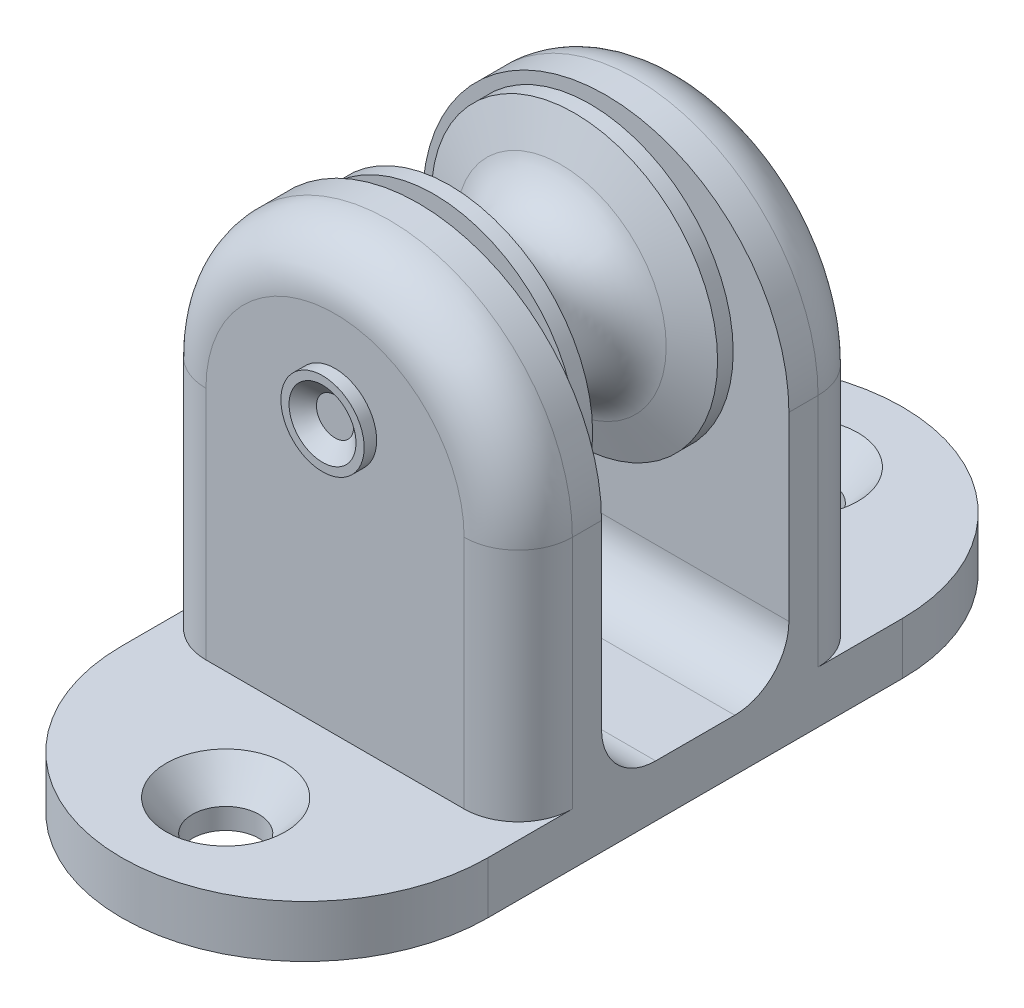
ISO-10303-21;
HEADER;
FILE_DESCRIPTION(('STEP AP214'),'2;1');
FILE_NAME('part.step','',(''),(''),'','','');
FILE_SCHEMA(('AUTOMOTIVE_DESIGN { 1 0 10303 214 1 1 1 1 }'));
ENDSEC;
DATA;
#1=APPLICATION_CONTEXT('core data for automotive mechanical design processes');
#2=APPLICATION_PROTOCOL_DEFINITION('international standard','automotive_design',2000,#1);
#3=PRODUCT_CONTEXT('',#1,'mechanical');
#4=PRODUCT('Part','Part','',(#3));
#5=PRODUCT_RELATED_PRODUCT_CATEGORY('part','',(#4));
#6=PRODUCT_DEFINITION_FORMATION('','',#4);
#7=PRODUCT_DEFINITION_CONTEXT('part definition',#1,'design');
#8=PRODUCT_DEFINITION('design','',#6,#7);
#9=PRODUCT_DEFINITION_SHAPE('','',#8);
#10=(LENGTH_UNIT() NAMED_UNIT(*) SI_UNIT(.MILLI.,.METRE.));
#11=(NAMED_UNIT(*) PLANE_ANGLE_UNIT() SI_UNIT($,.RADIAN.));
#12=(NAMED_UNIT(*) SI_UNIT($,.STERADIAN.) SOLID_ANGLE_UNIT());
#13=UNCERTAINTY_MEASURE_WITH_UNIT(LENGTH_MEASURE(1.E-05),#10,'distance_accuracy_value','');
#14=(GEOMETRIC_REPRESENTATION_CONTEXT(3) GLOBAL_UNCERTAINTY_ASSIGNED_CONTEXT((#13)) GLOBAL_UNIT_ASSIGNED_CONTEXT((#10,
#11,#12)) REPRESENTATION_CONTEXT('',''));
#15=CARTESIAN_POINT('',(0.,0.,0.));
#16=DIRECTION('',(0.,0.,1.));
#17=DIRECTION('',(1.,0.,0.));
#18=AXIS2_PLACEMENT_3D('',#15,#16,#17);
#19=CARTESIAN_POINT('',(11.176,-16.79575,23.8125));
#20=DIRECTION('',(0.,1.,0.));
#21=DIRECTION('',(0.,0.,1.));
#22=AXIS2_PLACEMENT_3D('',#19,#20,#21);
#23=PLANE('',#22);
#24=CARTESIAN_POINT('',(0.,-16.79575,-17.4625));
#25=DIRECTION('',(0.,1.,0.));
#26=DIRECTION('',(0.,0.,1.));
#27=AXIS2_PLACEMENT_3D('',#24,#25,#26);
#28=CIRCLE('',#27,3.63048479739272);
#29=CARTESIAN_POINT('',(0.,-16.79575,-13.8320152026073));
#30=VERTEX_POINT('',#29);
#31=EDGE_CURVE('E387',#30,#30,#28,.F.);
#32=ORIENTED_EDGE('',*,*,#31,.T.);
#33=EDGE_LOOP('',(#32));
#34=FACE_BOUND('',#33,.T.);
#35=DIRECTION('',(0.,0.,-1.));
#36=VECTOR('',#35,1.);
#37=CARTESIAN_POINT('',(11.176,-16.79575,23.8125));
#38=LINE('',#37,#36);
#39=CARTESIAN_POINT('',(11.176,-16.79575,-7.493));
#40=VERTEX_POINT('',#39);
#41=CARTESIAN_POINT('',(11.176,-16.79575,-12.6365));
#42=VERTEX_POINT('',#41);
#43=EDGE_CURVE('E191',#40,#42,#38,.T.);
#44=ORIENTED_EDGE('',*,*,#43,.T.);
#45=CARTESIAN_POINT('',(0.,-16.79575,-12.6365));
#46=DIRECTION('',(0.,1.,0.));
#47=DIRECTION('',(0.,0.,1.));
#48=AXIS2_PLACEMENT_3D('',#45,#46,#47);
#49=CIRCLE('',#48,11.176);
#50=CARTESIAN_POINT('',(-11.176,-16.79575,-12.6365));
#51=VERTEX_POINT('',#50);
#52=EDGE_CURVE('E274',#42,#51,#49,.T.);
#53=ORIENTED_EDGE('',*,*,#52,.T.);
#54=DIRECTION('',(0.,0.,1.));
#55=VECTOR('',#54,1.);
#56=CARTESIAN_POINT('',(-11.176,-16.79575,-23.8125));
#57=LINE('',#56,#55);
#58=CARTESIAN_POINT('',(-11.176,-16.79575,-7.493));
#59=VERTEX_POINT('',#58);
#60=EDGE_CURVE('E216',#51,#59,#57,.T.);
#61=ORIENTED_EDGE('',*,*,#60,.T.);
#62=CARTESIAN_POINT('',(-7.874,-16.79575,-7.493));
#63=DIRECTION('',(0.,1.,0.));
#64=DIRECTION('',(0.,0.,1.));
#65=AXIS2_PLACEMENT_3D('',#62,#63,#64);
#66=CIRCLE('',#65,3.302);
#67=CARTESIAN_POINT('',(-7.874,-16.79575,-10.795));
#68=VERTEX_POINT('',#67);
#69=EDGE_CURVE('E250',#59,#68,#66,.F.);
#70=ORIENTED_EDGE('',*,*,#69,.T.);
#71=DIRECTION('',(-1.,0.,0.));
#72=VECTOR('',#71,1.);
#73=CARTESIAN_POINT('',(11.176,-16.79575,-10.795));
#74=LINE('',#73,#72);
#75=CARTESIAN_POINT('',(7.874,-16.79575,-10.795));
#76=VERTEX_POINT('',#75);
#77=EDGE_CURVE('E245',#76,#68,#74,.T.);
#78=ORIENTED_EDGE('',*,*,#77,.F.);
#79=CARTESIAN_POINT('',(7.874,-16.79575,-7.493));
#80=DIRECTION('',(0.,1.,0.));
#81=DIRECTION('',(0.,0.,1.));
#82=AXIS2_PLACEMENT_3D('',#79,#80,#81);
#83=CIRCLE('',#82,3.302);
#84=EDGE_CURVE('E322',#76,#40,#83,.F.);
#85=ORIENTED_EDGE('',*,*,#84,.T.);
#86=EDGE_LOOP('',(#44,#53,#61,#70,#78,#85));
#87=FACE_BOUND('',#86,.T.);
#88=ADVANCED_FACE('F41',(#34,#87),#23,.T.);
#89=CARTESIAN_POINT('',(0.,-16.79575,17.4625));
#90=DIRECTION('',(0.,1.,0.));
#91=DIRECTION('',(0.,0.,1.));
#92=AXIS2_PLACEMENT_3D('',#89,#90,#91);
#93=CIRCLE('',#92,3.63048479739272);
#94=CARTESIAN_POINT('',(0.,-16.79575,21.0929847973927));
#95=VERTEX_POINT('',#94);
#96=EDGE_CURVE('E379',#95,#95,#93,.F.);
#97=ORIENTED_EDGE('',*,*,#96,.T.);
#98=EDGE_LOOP('',(#97));
#99=FACE_BOUND('',#98,.T.);
#100=CARTESIAN_POINT('',(-11.176,-16.79575,7.493));
#101=VERTEX_POINT('',#100);
#102=CARTESIAN_POINT('',(-11.176,-16.79575,12.6365));
#103=VERTEX_POINT('',#102);
#104=EDGE_CURVE('E199',#101,#103,#57,.T.);
#105=ORIENTED_EDGE('',*,*,#104,.T.);
#106=CARTESIAN_POINT('',(0.,-16.79575,12.6365));
#107=DIRECTION('',(0.,1.,0.));
#108=DIRECTION('',(0.,0.,1.));
#109=AXIS2_PLACEMENT_3D('',#106,#107,#108);
#110=CIRCLE('',#109,11.176);
#111=CARTESIAN_POINT('',(11.176,-16.79575,12.6365));
#112=VERTEX_POINT('',#111);
#113=EDGE_CURVE('E59',#103,#112,#110,.T.);
#114=ORIENTED_EDGE('',*,*,#113,.T.);
#115=CARTESIAN_POINT('',(11.176,-16.79575,7.493));
#116=VERTEX_POINT('',#115);
#117=EDGE_CURVE('E45',#112,#116,#38,.T.);
#118=ORIENTED_EDGE('',*,*,#117,.T.);
#119=CARTESIAN_POINT('',(7.874,-16.79575,7.493));
#120=DIRECTION('',(0.,1.,0.));
#121=DIRECTION('',(0.,0.,1.));
#122=AXIS2_PLACEMENT_3D('',#119,#120,#121);
#123=CIRCLE('',#122,3.302);
#124=CARTESIAN_POINT('',(7.874,-16.79575,10.795));
#125=VERTEX_POINT('',#124);
#126=EDGE_CURVE('E325',#116,#125,#123,.F.);
#127=ORIENTED_EDGE('',*,*,#126,.T.);
#128=DIRECTION('',(-1.,0.,0.));
#129=VECTOR('',#128,1.);
#130=CARTESIAN_POINT('',(11.176,-16.79575,10.795));
#131=LINE('',#130,#129);
#132=CARTESIAN_POINT('',(-7.874,-16.79575,10.795));
#133=VERTEX_POINT('',#132);
#134=EDGE_CURVE('E285',#125,#133,#131,.T.);
#135=ORIENTED_EDGE('',*,*,#134,.T.);
#136=CARTESIAN_POINT('',(-7.874,-16.79575,7.493));
#137=DIRECTION('',(0.,1.,0.));
#138=DIRECTION('',(0.,0.,1.));
#139=AXIS2_PLACEMENT_3D('',#136,#137,#138);
#140=CIRCLE('',#139,3.302);
#141=EDGE_CURVE('E13',#133,#101,#140,.F.);
#142=ORIENTED_EDGE('',*,*,#141,.T.);
#143=EDGE_LOOP('',(#105,#114,#118,#127,#135,#142));
#144=FACE_BOUND('',#143,.T.);
#145=ADVANCED_FACE('F358',(#99,#144),#23,.T.);
#146=CARTESIAN_POINT('',(11.176,-19.97075,23.8125));
#147=DIRECTION('',(0.,1.,0.));
#148=DIRECTION('',(0.,0.,1.));
#149=AXIS2_PLACEMENT_3D('',#146,#147,#148);
#150=PLANE('',#149);
#151=CARTESIAN_POINT('',(0.,-19.97075,17.4625));
#152=DIRECTION('',(0.,1.,0.));
#153=DIRECTION('',(0.,0.,1.));
#154=AXIS2_PLACEMENT_3D('',#151,#152,#153);
#155=CIRCLE('',#154,2.032);
#156=CARTESIAN_POINT('',(0.,-19.97075,19.4945));
#157=VERTEX_POINT('',#156);
#158=EDGE_CURVE('E189',#157,#157,#155,.T.);
#159=ORIENTED_EDGE('',*,*,#158,.T.);
#160=EDGE_LOOP('',(#159));
#161=FACE_BOUND('',#160,.T.);
#162=CARTESIAN_POINT('',(0.,-19.97075,-17.4625));
#163=DIRECTION('',(0.,1.,0.));
#164=DIRECTION('',(0.,0.,1.));
#165=AXIS2_PLACEMENT_3D('',#162,#163,#164);
#166=CIRCLE('',#165,2.032);
#167=CARTESIAN_POINT('',(0.,-19.97075,-15.4305));
#168=VERTEX_POINT('',#167);
#169=EDGE_CURVE('E194',#168,#168,#166,.T.);
#170=ORIENTED_EDGE('',*,*,#169,.T.);
#171=EDGE_LOOP('',(#170));
#172=FACE_BOUND('',#171,.T.);
#173=CARTESIAN_POINT('',(0.,-19.97075,12.6365));
#174=DIRECTION('',(0.,1.,0.));
#175=DIRECTION('',(0.,0.,1.));
#176=AXIS2_PLACEMENT_3D('',#173,#174,#175);
#177=CIRCLE('',#176,11.176);
#178=CARTESIAN_POINT('',(-11.176,-19.97075,12.6365));
#179=VERTEX_POINT('',#178);
#180=CARTESIAN_POINT('',(11.176,-19.97075,12.6365));
#181=VERTEX_POINT('',#180);
#182=EDGE_CURVE('E168',#179,#181,#177,.T.);
#183=ORIENTED_EDGE('',*,*,#182,.F.);
#184=DIRECTION('',(0.,0.,1.));
#185=VECTOR('',#184,1.);
#186=CARTESIAN_POINT('',(-11.176,-19.97075,-23.8125));
#187=LINE('',#186,#185);
#188=CARTESIAN_POINT('',(-11.176,-19.97075,-12.6365));
#189=VERTEX_POINT('',#188);
#190=EDGE_CURVE('E188',#189,#179,#187,.T.);
#191=ORIENTED_EDGE('',*,*,#190,.F.);
#192=CARTESIAN_POINT('',(0.,-19.97075,-12.6365));
#193=DIRECTION('',(0.,1.,0.));
#194=DIRECTION('',(0.,0.,-1.));
#195=AXIS2_PLACEMENT_3D('',#192,#193,#194);
#196=CIRCLE('',#195,11.176);
#197=CARTESIAN_POINT('',(11.176,-19.97075,-12.6365));
#198=VERTEX_POINT('',#197);
#199=EDGE_CURVE('E67',#198,#189,#196,.T.);
#200=ORIENTED_EDGE('',*,*,#199,.F.);
#201=DIRECTION('',(0.,0.,-1.));
#202=VECTOR('',#201,1.);
#203=CARTESIAN_POINT('',(11.176,-19.97075,23.8125));
#204=LINE('',#203,#202);
#205=EDGE_CURVE('E183',#181,#198,#204,.T.);
#206=ORIENTED_EDGE('',*,*,#205,.F.);
#207=EDGE_LOOP('',(#183,#191,#200,#206));
#208=FACE_BOUND('',#207,.T.);
#209=ADVANCED_FACE('F187',(#161,#172,#208),#150,.F.);
#210=CARTESIAN_POINT('',(11.176,-16.79575,23.8125));
#211=DIRECTION('',(-1.,0.,0.));
#212=DIRECTION('',(0.,0.,1.));
#213=AXIS2_PLACEMENT_3D('',#210,#211,#212);
#214=PLANE('',#213);
#215=DIRECTION('',(0.,1.,0.));
#216=VECTOR('',#215,1.);
#217=CARTESIAN_POINT('',(11.176,-19.97075,12.6365));
#218=LINE('',#217,#216);
#219=EDGE_CURVE('E171',#181,#112,#218,.T.);
#220=ORIENTED_EDGE('',*,*,#219,.F.);
#221=ORIENTED_EDGE('',*,*,#205,.T.);
#222=DIRECTION('',(0.,1.,0.));
#223=VECTOR('',#222,1.);
#224=CARTESIAN_POINT('',(11.176,-19.97075,-12.6365));
#225=LINE('',#224,#223);
#226=EDGE_CURVE('E185',#198,#42,#225,.T.);
#227=ORIENTED_EDGE('',*,*,#226,.T.);
#228=ORIENTED_EDGE('',*,*,#43,.F.);
#229=DIRECTION('',(0.,-1.,0.));
#230=VECTOR('',#229,1.);
#231=CARTESIAN_POINT('',(11.176,-16.79575,-7.493));
#232=LINE('',#231,#230);
#233=CARTESIAN_POINT('',(11.176,-2.44475,-7.493));
#234=VERTEX_POINT('',#233);
#235=EDGE_CURVE('E301',#40,#234,#232,.F.);
#236=ORIENTED_EDGE('',*,*,#235,.T.);
#237=DIRECTION('',(0.,0.,-1.));
#238=VECTOR('',#237,1.);
#239=CARTESIAN_POINT('',(11.176,-2.44475,-5.71499999999999));
#240=LINE('',#239,#238);
#241=CARTESIAN_POINT('',(11.176,-2.44475,-5.71499999999999));
#242=VERTEX_POINT('',#241);
#243=EDGE_CURVE('E286',#242,#234,#240,.T.);
#244=ORIENTED_EDGE('',*,*,#243,.F.);
#245=DIRECTION('',(0.,-1.,0.));
#246=VECTOR('',#245,1.);
#247=CARTESIAN_POINT('',(11.176,-2.44475,-5.71499999999999));
#248=LINE('',#247,#246);
#249=CARTESIAN_POINT('',(11.176,-13.49375,-5.71499999999999));
#250=VERTEX_POINT('',#249);
#251=EDGE_CURVE('E292',#242,#250,#248,.T.);
#252=ORIENTED_EDGE('',*,*,#251,.T.);
#253=CARTESIAN_POINT('',(11.176,-13.49375,-2.41299999999999));
#254=DIRECTION('',(-1.,0.,0.));
#255=DIRECTION('',(0.,0.,1.));
#256=AXIS2_PLACEMENT_3D('',#253,#254,#255);
#257=CIRCLE('',#256,3.302);
#258=CARTESIAN_POINT('',(11.176,-16.79575,-2.41299999999999));
#259=VERTEX_POINT('',#258);
#260=EDGE_CURVE('E51',#250,#259,#257,.T.);
#261=ORIENTED_EDGE('',*,*,#260,.T.);
#262=CARTESIAN_POINT('',(11.176,-16.79575,2.41299999999999));
#263=VERTEX_POINT('',#262);
#264=EDGE_CURVE('E223',#263,#259,#38,.T.);
#265=ORIENTED_EDGE('',*,*,#264,.F.);
#266=CARTESIAN_POINT('',(11.176,-13.49375,2.41299999999999));
#267=DIRECTION('',(-1.,0.,0.));
#268=DIRECTION('',(0.,0.,1.));
#269=AXIS2_PLACEMENT_3D('',#266,#267,#268);
#270=CIRCLE('',#269,3.302);
#271=CARTESIAN_POINT('',(11.176,-13.49375,5.71499999999999));
#272=VERTEX_POINT('',#271);
#273=EDGE_CURVE('E329',#263,#272,#270,.T.);
#274=ORIENTED_EDGE('',*,*,#273,.T.);
#275=DIRECTION('',(0.,-1.,0.));
#276=VECTOR('',#275,1.);
#277=CARTESIAN_POINT('',(11.176,-2.44475,5.71499999999999));
#278=LINE('',#277,#276);
#279=CARTESIAN_POINT('',(11.176,-2.44475,5.71499999999999));
#280=VERTEX_POINT('',#279);
#281=EDGE_CURVE('E205',#280,#272,#278,.T.);
#282=ORIENTED_EDGE('',*,*,#281,.F.);
#283=DIRECTION('',(0.,0.,1.));
#284=VECTOR('',#283,1.);
#285=CARTESIAN_POINT('',(11.176,-2.44475,5.71499999999999));
#286=LINE('',#285,#284);
#287=CARTESIAN_POINT('',(11.176,-2.44475,7.493));
#288=VERTEX_POINT('',#287);
#289=EDGE_CURVE('E375',#280,#288,#286,.T.);
#290=ORIENTED_EDGE('',*,*,#289,.T.);
#291=DIRECTION('',(0.,-1.,0.));
#292=VECTOR('',#291,1.);
#293=CARTESIAN_POINT('',(11.176,-16.79575,7.493));
#294=LINE('',#293,#292);
#295=EDGE_CURVE('E222',#288,#116,#294,.T.);
#296=ORIENTED_EDGE('',*,*,#295,.T.);
#297=ORIENTED_EDGE('',*,*,#117,.F.);
#298=EDGE_LOOP('',(#220,#221,#227,#228,#236,#244,#252,#261,#265,#274,#282,#290,#296,#297));
#299=FACE_BOUND('',#298,.T.);
#300=ADVANCED_FACE('F181',(#299),#214,.F.);
#301=CARTESIAN_POINT('',(-11.176,-16.79575,-23.8125));
#302=DIRECTION('',(1.,0.,0.));
#303=DIRECTION('',(0.,0.,-1.));
#304=AXIS2_PLACEMENT_3D('',#301,#302,#303);
#305=PLANE('',#304);
#306=ORIENTED_EDGE('',*,*,#190,.T.);
#307=DIRECTION('',(0.,1.,0.));
#308=VECTOR('',#307,1.);
#309=CARTESIAN_POINT('',(-11.176,-19.97075,12.6365));
#310=LINE('',#309,#308);
#311=EDGE_CURVE('E172',#179,#103,#310,.T.);
#312=ORIENTED_EDGE('',*,*,#311,.T.);
#313=ORIENTED_EDGE('',*,*,#104,.F.);
#314=DIRECTION('',(0.,1.,0.));
#315=VECTOR('',#314,1.);
#316=CARTESIAN_POINT('',(-11.176,-16.79575,7.493));
#317=LINE('',#316,#315);
#318=CARTESIAN_POINT('',(-11.176,-2.44475,7.493));
#319=VERTEX_POINT('',#318);
#320=EDGE_CURVE('E217',#101,#319,#317,.T.);
#321=ORIENTED_EDGE('',*,*,#320,.T.);
#322=DIRECTION('',(0.,0.,1.));
#323=VECTOR('',#322,1.);
#324=CARTESIAN_POINT('',(-11.176,-2.44475,5.71499999999999));
#325=LINE('',#324,#323);
#326=CARTESIAN_POINT('',(-11.176,-2.44475,5.71499999999999));
#327=VERTEX_POINT('',#326);
#328=EDGE_CURVE('E211',#327,#319,#325,.T.);
#329=ORIENTED_EDGE('',*,*,#328,.F.);
#330=DIRECTION('',(0.,1.,0.));
#331=VECTOR('',#330,1.);
#332=CARTESIAN_POINT('',(-11.176,-2.44475,5.71499999999999));
#333=LINE('',#332,#331);
#334=CARTESIAN_POINT('',(-11.176,-13.49375,5.71499999999999));
#335=VERTEX_POINT('',#334);
#336=EDGE_CURVE('E208',#335,#327,#333,.T.);
#337=ORIENTED_EDGE('',*,*,#336,.F.);
#338=CARTESIAN_POINT('',(-11.176,-13.49375,2.41299999999999));
#339=DIRECTION('',(1.,0.,0.));
#340=DIRECTION('',(0.,0.,-1.));
#341=AXIS2_PLACEMENT_3D('',#338,#339,#340);
#342=CIRCLE('',#341,3.302);
#343=CARTESIAN_POINT('',(-11.176,-16.79575,2.41299999999999));
#344=VERTEX_POINT('',#343);
#345=EDGE_CURVE('E327',#335,#344,#342,.T.);
#346=ORIENTED_EDGE('',*,*,#345,.T.);
#347=CARTESIAN_POINT('',(-11.176,-16.79575,-2.41299999999999));
#348=VERTEX_POINT('',#347);
#349=EDGE_CURVE('E202',#348,#344,#57,.T.);
#350=ORIENTED_EDGE('',*,*,#349,.F.);
#351=CARTESIAN_POINT('',(-11.176,-13.49375,-2.41299999999999));
#352=DIRECTION('',(1.,0.,0.));
#353=DIRECTION('',(0.,0.,-1.));
#354=AXIS2_PLACEMENT_3D('',#351,#352,#353);
#355=CIRCLE('',#354,3.302);
#356=CARTESIAN_POINT('',(-11.176,-13.49375,-5.71499999999999));
#357=VERTEX_POINT('',#356);
#358=EDGE_CURVE('E331',#348,#357,#355,.T.);
#359=ORIENTED_EDGE('',*,*,#358,.T.);
#360=DIRECTION('',(0.,1.,0.));
#361=VECTOR('',#360,1.);
#362=CARTESIAN_POINT('',(-11.176,-2.44475,-5.71499999999999));
#363=LINE('',#362,#361);
#364=CARTESIAN_POINT('',(-11.176,-2.44475,-5.71499999999999));
#365=VERTEX_POINT('',#364);
#366=EDGE_CURVE('E281',#357,#365,#363,.T.);
#367=ORIENTED_EDGE('',*,*,#366,.T.);
#368=DIRECTION('',(0.,0.,-1.));
#369=VECTOR('',#368,1.);
#370=CARTESIAN_POINT('',(-11.176,-2.44475,-5.71499999999999));
#371=LINE('',#370,#369);
#372=CARTESIAN_POINT('',(-11.176,-2.44475,-7.493));
#373=VERTEX_POINT('',#372);
#374=EDGE_CURVE('E279',#365,#373,#371,.T.);
#375=ORIENTED_EDGE('',*,*,#374,.T.);
#376=DIRECTION('',(0.,1.,0.));
#377=VECTOR('',#376,1.);
#378=CARTESIAN_POINT('',(-11.176,-16.79575,-7.493));
#379=LINE('',#378,#377);
#380=EDGE_CURVE('E219',#373,#59,#379,.F.);
#381=ORIENTED_EDGE('',*,*,#380,.T.);
#382=ORIENTED_EDGE('',*,*,#60,.F.);
#383=DIRECTION('',(0.,1.,0.));
#384=VECTOR('',#383,1.);
#385=CARTESIAN_POINT('',(-11.176,-19.97075,-12.6365));
#386=LINE('',#385,#384);
#387=EDGE_CURVE('E354',#189,#51,#386,.T.);
#388=ORIENTED_EDGE('',*,*,#387,.F.);
#389=EDGE_LOOP('',(#306,#312,#313,#321,#329,#337,#346,#350,#359,#367,#375,#381,#382,#388));
#390=FACE_BOUND('',#389,.T.);
#391=ADVANCED_FACE('F277',(#390),#305,.F.);
#392=ORIENTED_EDGE('',*,*,#349,.T.);
#393=DIRECTION('',(-1.,0.,0.));
#394=VECTOR('',#393,1.);
#395=CARTESIAN_POINT('',(11.176,-16.79575,2.41299999999999));
#396=LINE('',#395,#394);
#397=EDGE_CURVE('E316',#344,#263,#396,.F.);
#398=ORIENTED_EDGE('',*,*,#397,.T.);
#399=ORIENTED_EDGE('',*,*,#264,.T.);
#400=DIRECTION('',(-1.,0.,0.));
#401=VECTOR('',#400,1.);
#402=CARTESIAN_POINT('',(-11.176,-16.79575,-2.41299999999999));
#403=LINE('',#402,#401);
#404=EDGE_CURVE('E313',#259,#348,#403,.T.);
#405=ORIENTED_EDGE('',*,*,#404,.T.);
#406=EDGE_LOOP('',(#392,#398,#399,#405));
#407=FACE_BOUND('',#406,.T.);
#408=ADVANCED_FACE('F342',(#407),#23,.T.);
#409=CARTESIAN_POINT('',(0.,-16.79575,17.4625));
#410=DIRECTION('',(0.,-1.,0.));
#411=DIRECTION('',(0.,0.,-1.));
#412=AXIS2_PLACEMENT_3D('',#409,#410,#411);
#413=CYLINDRICAL_SURFACE('',#412,2.032);
#414=CARTESIAN_POINT('',(0.,-18.70075,17.4625));
#415=DIRECTION('',(0.,-1.,0.));
#416=DIRECTION('',(0.,0.,-1.));
#417=AXIS2_PLACEMENT_3D('',#414,#415,#416);
#418=CIRCLE('',#417,2.032);
#419=CARTESIAN_POINT('',(0.,-18.70075,15.4305));
#420=VERTEX_POINT('',#419);
#421=EDGE_CURVE('E376',#420,#420,#418,.T.);
#422=ORIENTED_EDGE('',*,*,#421,.F.);
#423=EDGE_LOOP('',(#422));
#424=FACE_BOUND('',#423,.T.);
#425=ORIENTED_EDGE('',*,*,#158,.F.);
#426=EDGE_LOOP('',(#425));
#427=FACE_BOUND('',#426,.T.);
#428=ADVANCED_FACE('F396',(#424,#427),#413,.F.);
#429=CARTESIAN_POINT('',(0.,-16.79575,-17.4625));
#430=DIRECTION('',(0.,-1.,0.));
#431=DIRECTION('',(0.,0.,-1.));
#432=AXIS2_PLACEMENT_3D('',#429,#430,#431);
#433=CYLINDRICAL_SURFACE('',#432,2.032);
#434=CARTESIAN_POINT('',(0.,-18.70075,-17.4625));
#435=DIRECTION('',(0.,-1.,0.));
#436=DIRECTION('',(0.,0.,-1.));
#437=AXIS2_PLACEMENT_3D('',#434,#435,#436);
#438=CIRCLE('',#437,2.032);
#439=CARTESIAN_POINT('',(0.,-18.70075,-19.4945));
#440=VERTEX_POINT('',#439);
#441=EDGE_CURVE('E384',#440,#440,#438,.T.);
#442=ORIENTED_EDGE('',*,*,#441,.F.);
#443=EDGE_LOOP('',(#442));
#444=FACE_BOUND('',#443,.T.);
#445=ORIENTED_EDGE('',*,*,#169,.F.);
#446=EDGE_LOOP('',(#445));
#447=FACE_BOUND('',#446,.T.);
#448=ADVANCED_FACE('F393',(#444,#447),#433,.F.);
#449=CARTESIAN_POINT('',(0.,-18.70075,-17.4625));
#450=DIRECTION('',(0.,1.,0.));
#451=DIRECTION('',(0.,0.,-1.));
#452=AXIS2_PLACEMENT_3D('',#449,#450,#451);
#453=CONICAL_SURFACE('',#452,2.032,0.698131700797733);
#454=ORIENTED_EDGE('',*,*,#441,.T.);
#455=EDGE_LOOP('',(#454));
#456=FACE_BOUND('',#455,.T.);
#457=ORIENTED_EDGE('',*,*,#31,.F.);
#458=EDGE_LOOP('',(#457));
#459=FACE_BOUND('',#458,.T.);
#460=ADVANCED_FACE('F395',(#456,#459),#453,.F.);
#461=CARTESIAN_POINT('',(0.,-18.70075,17.4625));
#462=DIRECTION('',(0.,1.,0.));
#463=DIRECTION('',(0.,0.,-1.));
#464=AXIS2_PLACEMENT_3D('',#461,#462,#463);
#465=CONICAL_SURFACE('',#464,2.032,0.698131700797733);
#466=ORIENTED_EDGE('',*,*,#421,.T.);
#467=EDGE_LOOP('',(#466));
#468=FACE_BOUND('',#467,.T.);
#469=ORIENTED_EDGE('',*,*,#96,.F.);
#470=EDGE_LOOP('',(#469));
#471=FACE_BOUND('',#470,.T.);
#472=ADVANCED_FACE('F403',(#468,#471),#465,.F.);
#473=CARTESIAN_POINT('',(0.,-2.44475,5.71499999999999));
#474=DIRECTION('',(0.,0.,1.));
#475=DIRECTION('',(1.,0.,0.));
#476=AXIS2_PLACEMENT_3D('',#473,#474,#475);
#477=CYLINDRICAL_SURFACE('',#476,11.176);
#478=ORIENTED_EDGE('',*,*,#328,.T.);
#479=CARTESIAN_POINT('',(0.,-2.44475,7.493));
#480=DIRECTION('',(0.,0.,-1.));
#481=DIRECTION('',(-1.,0.,0.));
#482=AXIS2_PLACEMENT_3D('',#479,#480,#481);
#483=CIRCLE('',#482,11.176);
#484=EDGE_CURVE('E308',#319,#288,#483,.T.);
#485=ORIENTED_EDGE('',*,*,#484,.T.);
#486=ORIENTED_EDGE('',*,*,#289,.F.);
#487=CARTESIAN_POINT('',(0.,-2.44475,5.71499999999999));
#488=DIRECTION('',(0.,0.,-1.));
#489=DIRECTION('',(-1.,0.,0.));
#490=AXIS2_PLACEMENT_3D('',#487,#488,#489);
#491=CIRCLE('',#490,11.176);
#492=EDGE_CURVE('E289',#327,#280,#491,.T.);
#493=ORIENTED_EDGE('',*,*,#492,.F.);
#494=EDGE_LOOP('',(#478,#485,#486,#493));
#495=FACE_BOUND('',#494,.T.);
#496=ADVANCED_FACE('F372',(#495),#477,.T.);
#497=CARTESIAN_POINT('',(0.,-2.44475,5.71499999999999));
#498=DIRECTION('',(0.,0.,-1.));
#499=DIRECTION('',(-1.,0.,0.));
#500=AXIS2_PLACEMENT_3D('',#497,#498,#499);
#501=PLANE('',#500);
#502=ORIENTED_EDGE('',*,*,#281,.T.);
#503=DIRECTION('',(-1.,0.,0.));
#504=VECTOR('',#503,1.);
#505=CARTESIAN_POINT('',(-11.176,-13.49375,5.71499999999999));
#506=LINE('',#505,#504);
#507=EDGE_CURVE('E310',#272,#335,#506,.T.);
#508=ORIENTED_EDGE('',*,*,#507,.T.);
#509=ORIENTED_EDGE('',*,*,#336,.T.);
#510=ORIENTED_EDGE('',*,*,#492,.T.);
#511=EDGE_LOOP('',(#502,#508,#509,#510));
#512=FACE_BOUND('',#511,.T.);
#513=ADVANCED_FACE('F453',(#512),#501,.T.);
#514=CARTESIAN_POINT('',(0.,-2.44475,10.795));
#515=DIRECTION('',(0.,0.,-1.));
#516=DIRECTION('',(-1.,0.,0.));
#517=AXIS2_PLACEMENT_3D('',#514,#515,#516);
#518=PLANE('',#517);
#519=ORIENTED_EDGE('',*,*,#134,.F.);
#520=DIRECTION('',(0.,-1.,0.));
#521=VECTOR('',#520,1.);
#522=CARTESIAN_POINT('',(7.874,-2.44475,10.795));
#523=LINE('',#522,#521);
#524=CARTESIAN_POINT('',(7.874,-2.44475,10.795));
#525=VERTEX_POINT('',#524);
#526=EDGE_CURVE('E306',#125,#525,#523,.F.);
#527=ORIENTED_EDGE('',*,*,#526,.T.);
#528=CARTESIAN_POINT('',(0.,-2.44475,10.795));
#529=DIRECTION('',(0.,0.,-1.));
#530=DIRECTION('',(-1.,0.,0.));
#531=AXIS2_PLACEMENT_3D('',#528,#529,#530);
#532=CIRCLE('',#531,7.874);
#533=CARTESIAN_POINT('',(-7.874,-2.44475,10.795));
#534=VERTEX_POINT('',#533);
#535=EDGE_CURVE('E304',#525,#534,#532,.F.);
#536=ORIENTED_EDGE('',*,*,#535,.T.);
#537=DIRECTION('',(0.,1.,0.));
#538=VECTOR('',#537,1.);
#539=CARTESIAN_POINT('',(-7.874,-2.44475,10.795));
#540=LINE('',#539,#538);
#541=EDGE_CURVE('E302',#534,#133,#540,.F.);
#542=ORIENTED_EDGE('',*,*,#541,.T.);
#543=EDGE_LOOP('',(#519,#527,#536,#542));
#544=FACE_BOUND('',#543,.T.);
#545=ADVANCED_FACE('F455',(#544),#518,.F.);
#546=CARTESIAN_POINT('',(0.,-2.44475,-5.71499999999999));
#547=DIRECTION('',(0.,0.,-1.));
#548=DIRECTION('',(-1.,0.,0.));
#549=AXIS2_PLACEMENT_3D('',#546,#547,#548);
#550=CYLINDRICAL_SURFACE('',#549,11.176);
#551=ORIENTED_EDGE('',*,*,#243,.T.);
#552=CARTESIAN_POINT('',(0.,-2.44475,-7.493));
#553=DIRECTION('',(0.,0.,1.));
#554=DIRECTION('',(1.,0.,0.));
#555=AXIS2_PLACEMENT_3D('',#552,#553,#554);
#556=CIRCLE('',#555,11.176);
#557=EDGE_CURVE('E261',#234,#373,#556,.T.);
#558=ORIENTED_EDGE('',*,*,#557,.T.);
#559=ORIENTED_EDGE('',*,*,#374,.F.);
#560=CARTESIAN_POINT('',(0.,-2.44475,-5.71499999999999));
#561=DIRECTION('',(0.,0.,-1.));
#562=DIRECTION('',(-1.,0.,0.));
#563=AXIS2_PLACEMENT_3D('',#560,#561,#562);
#564=CIRCLE('',#563,11.176);
#565=EDGE_CURVE('E265',#365,#242,#564,.T.);
#566=ORIENTED_EDGE('',*,*,#565,.T.);
#567=EDGE_LOOP('',(#551,#558,#559,#566));
#568=FACE_BOUND('',#567,.T.);
#569=ADVANCED_FACE('F461',(#568),#550,.T.);
#570=CARTESIAN_POINT('',(0.,-2.44475,-5.71499999999999));
#571=DIRECTION('',(0.,0.,1.));
#572=DIRECTION('',(-1.,0.,0.));
#573=AXIS2_PLACEMENT_3D('',#570,#571,#572);
#574=PLANE('',#573);
#575=ORIENTED_EDGE('',*,*,#366,.F.);
#576=DIRECTION('',(-1.,0.,0.));
#577=VECTOR('',#576,1.);
#578=CARTESIAN_POINT('',(11.176,-13.49375,-5.71499999999999));
#579=LINE('',#578,#577);
#580=EDGE_CURVE('E318',#357,#250,#579,.F.);
#581=ORIENTED_EDGE('',*,*,#580,.T.);
#582=ORIENTED_EDGE('',*,*,#251,.F.);
#583=ORIENTED_EDGE('',*,*,#565,.F.);
#584=EDGE_LOOP('',(#575,#581,#582,#583));
#585=FACE_BOUND('',#584,.T.);
#586=ADVANCED_FACE('F346',(#585),#574,.T.);
#587=CARTESIAN_POINT('',(0.,-2.44475,-10.795));
#588=DIRECTION('',(0.,0.,1.));
#589=DIRECTION('',(-1.,0.,0.));
#590=AXIS2_PLACEMENT_3D('',#587,#588,#589);
#591=PLANE('',#590);
#592=ORIENTED_EDGE('',*,*,#77,.T.);
#593=DIRECTION('',(0.,1.,0.));
#594=VECTOR('',#593,1.);
#595=CARTESIAN_POINT('',(-7.874,-2.44475,-10.795));
#596=LINE('',#595,#594);
#597=CARTESIAN_POINT('',(-7.874,-2.44475,-10.795));
#598=VERTEX_POINT('',#597);
#599=EDGE_CURVE('E212',#68,#598,#596,.T.);
#600=ORIENTED_EDGE('',*,*,#599,.T.);
#601=CARTESIAN_POINT('',(0.,-2.44475,-10.795));
#602=DIRECTION('',(0.,0.,1.));
#603=DIRECTION('',(1.,0.,0.));
#604=AXIS2_PLACEMENT_3D('',#601,#602,#603);
#605=CIRCLE('',#604,7.874);
#606=CARTESIAN_POINT('',(7.874,-2.44475,-10.795));
#607=VERTEX_POINT('',#606);
#608=EDGE_CURVE('E235',#598,#607,#605,.F.);
#609=ORIENTED_EDGE('',*,*,#608,.T.);
#610=DIRECTION('',(0.,-1.,0.));
#611=VECTOR('',#610,1.);
#612=CARTESIAN_POINT('',(7.874,-2.44475,-10.795));
#613=LINE('',#612,#611);
#614=EDGE_CURVE('E236',#607,#76,#613,.T.);
#615=ORIENTED_EDGE('',*,*,#614,.T.);
#616=EDGE_LOOP('',(#592,#600,#609,#615));
#617=FACE_BOUND('',#616,.T.);
#618=ADVANCED_FACE('F243',(#617),#591,.F.);
#619=CARTESIAN_POINT('',(7.874,-2.44475,-7.493));
#620=DIRECTION('',(0.,-1.,0.));
#621=DIRECTION('',(0.,0.,-1.));
#622=AXIS2_PLACEMENT_3D('',#619,#620,#621);
#623=CYLINDRICAL_SURFACE('',#622,3.302);
#624=ORIENTED_EDGE('',*,*,#84,.F.);
#625=ORIENTED_EDGE('',*,*,#614,.F.);
#626=CARTESIAN_POINT('',(7.874,-2.44475,-7.493));
#627=DIRECTION('',(0.,1.,0.));
#628=DIRECTION('',(0.,0.,1.));
#629=AXIS2_PLACEMENT_3D('',#626,#627,#628);
#630=CIRCLE('',#629,3.302);
#631=EDGE_CURVE('E255',#234,#607,#630,.T.);
#632=ORIENTED_EDGE('',*,*,#631,.F.);
#633=ORIENTED_EDGE('',*,*,#235,.F.);
#634=EDGE_LOOP('',(#624,#625,#632,#633));
#635=FACE_BOUND('',#634,.T.);
#636=ADVANCED_FACE('F431',(#635),#623,.T.);
#637=CARTESIAN_POINT('',(0.,-2.44475,-7.493));
#638=DIRECTION('',(0.,0.,1.));
#639=DIRECTION('',(1.,0.,0.));
#640=AXIS2_PLACEMENT_3D('',#637,#638,#639);
#641=TOROIDAL_SURFACE('',#640,7.874,3.302);
#642=ORIENTED_EDGE('',*,*,#631,.T.);
#643=ORIENTED_EDGE('',*,*,#608,.F.);
#644=CARTESIAN_POINT('',(-7.874,-2.44475,-7.493));
#645=DIRECTION('',(0.,-1.,0.));
#646=DIRECTION('',(0.,0.,-1.));
#647=AXIS2_PLACEMENT_3D('',#644,#645,#646);
#648=CIRCLE('',#647,3.302);
#649=EDGE_CURVE('E252',#373,#598,#648,.T.);
#650=ORIENTED_EDGE('',*,*,#649,.F.);
#651=ORIENTED_EDGE('',*,*,#557,.F.);
#652=EDGE_LOOP('',(#642,#643,#650,#651));
#653=FACE_BOUND('',#652,.T.);
#654=ADVANCED_FACE('F259',(#653),#641,.T.);
#655=CARTESIAN_POINT('',(-7.874,-2.44475,-7.493));
#656=DIRECTION('',(0.,1.,0.));
#657=DIRECTION('',(0.,0.,1.));
#658=AXIS2_PLACEMENT_3D('',#655,#656,#657);
#659=CYLINDRICAL_SURFACE('',#658,3.302);
#660=ORIENTED_EDGE('',*,*,#69,.F.);
#661=ORIENTED_EDGE('',*,*,#380,.F.);
#662=ORIENTED_EDGE('',*,*,#649,.T.);
#663=ORIENTED_EDGE('',*,*,#599,.F.);
#664=EDGE_LOOP('',(#660,#661,#662,#663));
#665=FACE_BOUND('',#664,.T.);
#666=ADVANCED_FACE('F248',(#665),#659,.T.);
#667=CARTESIAN_POINT('',(-7.874,-16.79575,7.493));
#668=DIRECTION('',(0.,1.,0.));
#669=DIRECTION('',(0.,0.,1.));
#670=AXIS2_PLACEMENT_3D('',#667,#668,#669);
#671=CYLINDRICAL_SURFACE('',#670,3.302);
#672=ORIENTED_EDGE('',*,*,#141,.F.);
#673=ORIENTED_EDGE('',*,*,#541,.F.);
#674=CARTESIAN_POINT('',(-7.874,-2.44475,7.493));
#675=DIRECTION('',(0.,1.,0.));
#676=DIRECTION('',(0.,0.,1.));
#677=AXIS2_PLACEMENT_3D('',#674,#675,#676);
#678=CIRCLE('',#677,3.302);
#679=EDGE_CURVE('E256',#319,#534,#678,.T.);
#680=ORIENTED_EDGE('',*,*,#679,.F.);
#681=ORIENTED_EDGE('',*,*,#320,.F.);
#682=EDGE_LOOP('',(#672,#673,#680,#681));
#683=FACE_BOUND('',#682,.T.);
#684=ADVANCED_FACE('F365',(#683),#671,.T.);
#685=CARTESIAN_POINT('',(0.,-2.44475,7.493));
#686=DIRECTION('',(0.,0.,-1.));
#687=DIRECTION('',(-1.,0.,0.));
#688=AXIS2_PLACEMENT_3D('',#685,#686,#687);
#689=TOROIDAL_SURFACE('',#688,7.874,3.302);
#690=ORIENTED_EDGE('',*,*,#679,.T.);
#691=ORIENTED_EDGE('',*,*,#535,.F.);
#692=CARTESIAN_POINT('',(7.874,-2.44475,7.493));
#693=DIRECTION('',(0.,-1.,0.));
#694=DIRECTION('',(0.,0.,-1.));
#695=AXIS2_PLACEMENT_3D('',#692,#693,#694);
#696=CIRCLE('',#695,3.302);
#697=EDGE_CURVE('E268',#288,#525,#696,.T.);
#698=ORIENTED_EDGE('',*,*,#697,.F.);
#699=ORIENTED_EDGE('',*,*,#484,.F.);
#700=EDGE_LOOP('',(#690,#691,#698,#699));
#701=FACE_BOUND('',#700,.T.);
#702=ADVANCED_FACE('F438',(#701),#689,.T.);
#703=CARTESIAN_POINT('',(7.874,-16.79575,7.493));
#704=DIRECTION('',(0.,-1.,0.));
#705=DIRECTION('',(0.,0.,-1.));
#706=AXIS2_PLACEMENT_3D('',#703,#704,#705);
#707=CYLINDRICAL_SURFACE('',#706,3.302);
#708=ORIENTED_EDGE('',*,*,#697,.T.);
#709=ORIENTED_EDGE('',*,*,#526,.F.);
#710=ORIENTED_EDGE('',*,*,#126,.F.);
#711=ORIENTED_EDGE('',*,*,#295,.F.);
#712=EDGE_LOOP('',(#708,#709,#710,#711));
#713=FACE_BOUND('',#712,.T.);
#714=ADVANCED_FACE('F434',(#713),#707,.T.);
#715=CARTESIAN_POINT('',(0.,-13.49375,2.41299999999999));
#716=DIRECTION('',(1.,0.,0.));
#717=DIRECTION('',(0.,0.,-1.));
#718=AXIS2_PLACEMENT_3D('',#715,#716,#717);
#719=CYLINDRICAL_SURFACE('',#718,3.302);
#720=ORIENTED_EDGE('',*,*,#273,.F.);
#721=ORIENTED_EDGE('',*,*,#397,.F.);
#722=ORIENTED_EDGE('',*,*,#345,.F.);
#723=ORIENTED_EDGE('',*,*,#507,.F.);
#724=EDGE_LOOP('',(#720,#721,#722,#723));
#725=FACE_BOUND('',#724,.T.);
#726=ADVANCED_FACE('F437',(#725),#719,.F.);
#727=CARTESIAN_POINT('',(11.176,-13.49375,-2.41299999999999));
#728=DIRECTION('',(1.,0.,0.));
#729=DIRECTION('',(0.,0.,-1.));
#730=AXIS2_PLACEMENT_3D('',#727,#728,#729);
#731=CYLINDRICAL_SURFACE('',#730,3.302);
#732=ORIENTED_EDGE('',*,*,#260,.F.);
#733=ORIENTED_EDGE('',*,*,#580,.F.);
#734=ORIENTED_EDGE('',*,*,#358,.F.);
#735=ORIENTED_EDGE('',*,*,#404,.F.);
#736=EDGE_LOOP('',(#732,#733,#734,#735));
#737=FACE_BOUND('',#736,.T.);
#738=ADVANCED_FACE('F43',(#737),#731,.F.);
#739=CARTESIAN_POINT('',(0.,-19.97075,-12.6365));
#740=DIRECTION('',(0.,1.,0.));
#741=DIRECTION('',(0.,0.,1.));
#742=AXIS2_PLACEMENT_3D('',#739,#740,#741);
#743=CYLINDRICAL_SURFACE('',#742,11.176);
#744=ORIENTED_EDGE('',*,*,#226,.F.);
#745=ORIENTED_EDGE('',*,*,#199,.T.);
#746=ORIENTED_EDGE('',*,*,#387,.T.);
#747=ORIENTED_EDGE('',*,*,#52,.F.);
#748=EDGE_LOOP('',(#744,#745,#746,#747));
#749=FACE_BOUND('',#748,.T.);
#750=ADVANCED_FACE('F449',(#749),#743,.T.);
#751=CARTESIAN_POINT('',(0.,-19.97075,12.6365));
#752=DIRECTION('',(0.,1.,0.));
#753=DIRECTION('',(0.,0.,1.));
#754=AXIS2_PLACEMENT_3D('',#751,#752,#753);
#755=CYLINDRICAL_SURFACE('',#754,11.176);
#756=ORIENTED_EDGE('',*,*,#113,.F.);
#757=ORIENTED_EDGE('',*,*,#311,.F.);
#758=ORIENTED_EDGE('',*,*,#182,.T.);
#759=ORIENTED_EDGE('',*,*,#219,.T.);
#760=EDGE_LOOP('',(#756,#757,#758,#759));
#761=FACE_BOUND('',#760,.T.);
#762=ADVANCED_FACE('F170',(#761),#755,.T.);
#763=CLOSED_SHELL('',(#88,#145,#209,#300,#391,#408,#428,#448,#460,#472,#496,#513,#545,#569,#586,
#618,#636,#654,#666,#684,#702,#714,#726,#738,#750,#762));
#764=MANIFOLD_SOLID_BREP('B2',#763);
#765=CARTESIAN_POINT('',(0.,0.,4.7625));
#766=DIRECTION('',(0.,0.,1.));
#767=DIRECTION('',(1.,0.,0.));
#768=AXIS2_PLACEMENT_3D('',#765,#766,#767);
#769=CYLINDRICAL_SURFACE('',#768,8.73125);
#770=CARTESIAN_POINT('',(0.,0.,4.7625));
#771=DIRECTION('',(0.,0.,1.));
#772=DIRECTION('',(1.,0.,0.));
#773=AXIS2_PLACEMENT_3D('',#770,#771,#772);
#774=CIRCLE('',#773,8.73125);
#775=CARTESIAN_POINT('',(8.73125,0.,4.7625));
#776=VERTEX_POINT('',#775);
#777=EDGE_CURVE('E674',#776,#776,#774,.T.);
#778=ORIENTED_EDGE('',*,*,#777,.F.);
#779=EDGE_LOOP('',(#778));
#780=FACE_BOUND('',#779,.T.);
#781=CARTESIAN_POINT('',(0.,0.,3.81));
#782=DIRECTION('',(0.,0.,1.));
#783=DIRECTION('',(1.,0.,0.));
#784=AXIS2_PLACEMENT_3D('',#781,#782,#783);
#785=CIRCLE('',#784,8.73125);
#786=CARTESIAN_POINT('',(8.73125,0.,3.81));
#787=VERTEX_POINT('',#786);
#788=EDGE_CURVE('E40',#787,#787,#785,.T.);
#789=ORIENTED_EDGE('',*,*,#788,.T.);
#790=EDGE_LOOP('',(#789));
#791=FACE_BOUND('',#790,.T.);
#792=ADVANCED_FACE('F652',(#780,#791),#769,.T.);
#793=CARTESIAN_POINT('',(0.,0.,2.99608610621043));
#794=DIRECTION('',(0.,0.,1.));
#795=DIRECTION('',(1.,0.,0.));
#796=AXIS2_PLACEMENT_3D('',#793,#794,#795);
#797=CONICAL_SURFACE('',#796,6.41049168136871,1.23348884536513);
#798=ORIENTED_EDGE('',*,*,#788,.F.);
#799=EDGE_LOOP('',(#798));
#800=FACE_BOUND('',#799,.T.);
#801=CARTESIAN_POINT('',(0.,0.,2.99608610621043));
#802=DIRECTION('',(0.,0.,1.));
#803=DIRECTION('',(1.,0.,0.));
#804=AXIS2_PLACEMENT_3D('',#801,#802,#803);
#805=CIRCLE('',#804,6.41049168136871);
#806=CARTESIAN_POINT('',(6.41049168136871,0.,2.99608610621043));
#807=VERTEX_POINT('',#806);
#808=EDGE_CURVE('E659',#807,#807,#805,.T.);
#809=ORIENTED_EDGE('',*,*,#808,.T.);
#810=EDGE_LOOP('',(#809));
#811=FACE_BOUND('',#810,.T.);
#812=ADVANCED_FACE('F725',(#800,#811),#797,.T.);
#813=CARTESIAN_POINT('',(0.,0.,0.));
#814=DIRECTION('',(0.,0.,1.));
#815=DIRECTION('',(1.,0.,0.));
#816=AXIS2_PLACEMENT_3D('',#813,#814,#815);
#817=TOROIDAL_SURFACE('',#816,7.46125,3.175);
#818=ORIENTED_EDGE('',*,*,#808,.F.);
#819=EDGE_LOOP('',(#818));
#820=FACE_BOUND('',#819,.T.);
#821=CARTESIAN_POINT('',(0.,0.,-2.99608610621043));
#822=DIRECTION('',(0.,0.,1.));
#823=DIRECTION('',(1.,0.,0.));
#824=AXIS2_PLACEMENT_3D('',#821,#822,#823);
#825=CIRCLE('',#824,6.41049168136871);
#826=CARTESIAN_POINT('',(6.41049168136871,0.,-2.99608610621043));
#827=VERTEX_POINT('',#826);
#828=EDGE_CURVE('E663',#827,#827,#825,.T.);
#829=ORIENTED_EDGE('',*,*,#828,.T.);
#830=EDGE_LOOP('',(#829));
#831=FACE_BOUND('',#830,.T.);
#832=ADVANCED_FACE('F730',(#820,#831),#817,.F.);
#833=CARTESIAN_POINT('',(0.,0.,-3.81));
#834=DIRECTION('',(0.,0.,-1.));
#835=DIRECTION('',(-1.,0.,0.));
#836=AXIS2_PLACEMENT_3D('',#833,#834,#835);
#837=CONICAL_SURFACE('',#836,8.73125,1.23348884536513);
#838=ORIENTED_EDGE('',*,*,#828,.F.);
#839=EDGE_LOOP('',(#838));
#840=FACE_BOUND('',#839,.T.);
#841=CARTESIAN_POINT('',(0.,0.,-3.81));
#842=DIRECTION('',(0.,0.,1.));
#843=DIRECTION('',(1.,0.,0.));
#844=AXIS2_PLACEMENT_3D('',#841,#842,#843);
#845=CIRCLE('',#844,8.73125);
#846=CARTESIAN_POINT('',(8.73125,0.,-3.81));
#847=VERTEX_POINT('',#846);
#848=EDGE_CURVE('E668',#847,#847,#845,.T.);
#849=ORIENTED_EDGE('',*,*,#848,.T.);
#850=EDGE_LOOP('',(#849));
#851=FACE_BOUND('',#850,.T.);
#852=ADVANCED_FACE('F737',(#840,#851),#837,.T.);
#853=CARTESIAN_POINT('',(0.,0.,4.7625));
#854=DIRECTION('',(0.,0.,1.));
#855=DIRECTION('',(1.,0.,0.));
#856=AXIS2_PLACEMENT_3D('',#853,#854,#855);
#857=CYLINDRICAL_SURFACE('',#856,8.73125);
#858=ORIENTED_EDGE('',*,*,#848,.F.);
#859=EDGE_LOOP('',(#858));
#860=FACE_BOUND('',#859,.T.);
#861=CARTESIAN_POINT('',(0.,0.,-4.7625));
#862=DIRECTION('',(0.,0.,1.));
#863=DIRECTION('',(1.,0.,0.));
#864=AXIS2_PLACEMENT_3D('',#861,#862,#863);
#865=CIRCLE('',#864,8.73125);
#866=CARTESIAN_POINT('',(8.73125,0.,-4.7625));
#867=VERTEX_POINT('',#866);
#868=EDGE_CURVE('E671',#867,#867,#865,.T.);
#869=ORIENTED_EDGE('',*,*,#868,.T.);
#870=EDGE_LOOP('',(#869));
#871=FACE_BOUND('',#870,.T.);
#872=ADVANCED_FACE('F744',(#860,#871),#857,.T.);
#873=CARTESIAN_POINT('',(0.,0.,-4.7625));
#874=DIRECTION('',(0.,0.,1.));
#875=DIRECTION('',(1.,0.,0.));
#876=AXIS2_PLACEMENT_3D('',#873,#874,#875);
#877=PLANE('',#876);
#878=CARTESIAN_POINT('',(0.,0.,-4.7625));
#879=DIRECTION('',(0.,0.,1.));
#880=DIRECTION('',(1.,0.,0.));
#881=AXIS2_PLACEMENT_3D('',#878,#879,#880);
#882=CIRCLE('',#881,1.5875);
#883=CARTESIAN_POINT('',(1.5875,0.,-4.7625));
#884=VERTEX_POINT('',#883);
#885=EDGE_CURVE('E677',#884,#884,#882,.T.);
#886=ORIENTED_EDGE('',*,*,#885,.T.);
#887=EDGE_LOOP('',(#886));
#888=FACE_BOUND('',#887,.T.);
#889=ORIENTED_EDGE('',*,*,#868,.F.);
#890=EDGE_LOOP('',(#889));
#891=FACE_BOUND('',#890,.T.);
#892=ADVANCED_FACE('F721',(#888,#891),#877,.F.);
#893=CARTESIAN_POINT('',(0.,8.73125,4.7625));
#894=DIRECTION('',(0.,0.,-1.));
#895=DIRECTION('',(-1.,0.,0.));
#896=AXIS2_PLACEMENT_3D('',#893,#894,#895);
#897=PLANE('',#896);
#898=CARTESIAN_POINT('',(0.,0.,4.7625));
#899=DIRECTION('',(0.,0.,-1.));
#900=DIRECTION('',(-1.,0.,0.));
#901=AXIS2_PLACEMENT_3D('',#898,#899,#900);
#902=CIRCLE('',#901,1.5875);
#903=CARTESIAN_POINT('',(-1.5875,0.,4.7625));
#904=VERTEX_POINT('',#903);
#905=EDGE_CURVE('E655',#904,#904,#902,.T.);
#906=ORIENTED_EDGE('',*,*,#905,.T.);
#907=EDGE_LOOP('',(#906));
#908=FACE_BOUND('',#907,.T.);
#909=ORIENTED_EDGE('',*,*,#777,.T.);
#910=EDGE_LOOP('',(#909));
#911=FACE_BOUND('',#910,.T.);
#912=ADVANCED_FACE('F711',(#908,#911),#897,.F.);
#913=CARTESIAN_POINT('',(0.,0.,-13.081));
#914=DIRECTION('',(0.,0.,-1.));
#915=DIRECTION('',(0.,1.,0.));
#916=AXIS2_PLACEMENT_3D('',#913,#914,#915);
#917=CYLINDRICAL_SURFACE('',#916,2.54);
#918=CARTESIAN_POINT('',(0.,0.,11.557));
#919=DIRECTION('',(0.,0.,-1.));
#920=DIRECTION('',(0.,1.,0.));
#921=AXIS2_PLACEMENT_3D('',#918,#919,#920);
#922=CIRCLE('',#921,2.54);
#923=CARTESIAN_POINT('',(0.,2.54,11.557));
#924=VERTEX_POINT('',#923);
#925=EDGE_CURVE('E698',#924,#924,#922,.T.);
#926=ORIENTED_EDGE('',*,*,#925,.T.);
#927=EDGE_LOOP('',(#926));
#928=FACE_BOUND('',#927,.T.);
#929=CARTESIAN_POINT('',(0.,0.,10.795));
#930=DIRECTION('',(0.,0.,-1.));
#931=DIRECTION('',(0.,1.,0.));
#932=AXIS2_PLACEMENT_3D('',#929,#930,#931);
#933=CIRCLE('',#932,2.54);
#934=CARTESIAN_POINT('',(0.,2.54,10.795));
#935=VERTEX_POINT('',#934);
#936=EDGE_CURVE('E701',#935,#935,#933,.T.);
#937=ORIENTED_EDGE('',*,*,#936,.F.);
#938=EDGE_LOOP('',(#937));
#939=FACE_BOUND('',#938,.T.);
#940=ADVANCED_FACE('F708',(#928,#939),#917,.T.);
#941=CARTESIAN_POINT('',(0.,2.54,11.557));
#942=DIRECTION('',(0.,0.,1.));
#943=DIRECTION('',(0.,-1.,0.));
#944=AXIS2_PLACEMENT_3D('',#941,#942,#943);
#945=PLANE('',#944);
#946=CARTESIAN_POINT('',(0.,0.,11.557));
#947=DIRECTION('',(0.,0.,-1.));
#948=DIRECTION('',(0.,1.,0.));
#949=AXIS2_PLACEMENT_3D('',#946,#947,#948);
#950=CIRCLE('',#949,2.04155811877839);
#951=CARTESIAN_POINT('',(0.,2.04155811877839,11.557));
#952=VERTEX_POINT('',#951);
#953=EDGE_CURVE('E695',#952,#952,#950,.T.);
#954=ORIENTED_EDGE('',*,*,#953,.T.);
#955=EDGE_LOOP('',(#954));
#956=FACE_BOUND('',#955,.T.);
#957=ORIENTED_EDGE('',*,*,#925,.F.);
#958=EDGE_LOOP('',(#957));
#959=FACE_BOUND('',#958,.T.);
#960=ADVANCED_FACE('F710',(#956,#959),#945,.T.);
#961=CARTESIAN_POINT('',(0.,0.,11.557));
#962=DIRECTION('',(0.,0.,1.));
#963=DIRECTION('',(0.,-1.,0.));
#964=AXIS2_PLACEMENT_3D('',#961,#962,#963);
#965=CONICAL_SURFACE('',#964,2.04155811877839,0.872664625997158);
#966=CARTESIAN_POINT('',(0.,0.,10.795));
#967=DIRECTION('',(0.,0.,-1.));
#968=DIRECTION('',(0.,1.,0.));
#969=AXIS2_PLACEMENT_3D('',#966,#967,#968);
#970=CIRCLE('',#969,1.13344188122161);
#971=CARTESIAN_POINT('',(0.,1.13344188122161,10.795));
#972=VERTEX_POINT('',#971);
#973=EDGE_CURVE('E692',#972,#972,#970,.T.);
#974=ORIENTED_EDGE('',*,*,#973,.T.);
#975=EDGE_LOOP('',(#974));
#976=FACE_BOUND('',#975,.T.);
#977=ORIENTED_EDGE('',*,*,#953,.F.);
#978=EDGE_LOOP('',(#977));
#979=FACE_BOUND('',#978,.T.);
#980=ADVANCED_FACE('F718',(#976,#979),#965,.F.);
#981=CARTESIAN_POINT('',(0.,1.13344188122161,10.795));
#982=DIRECTION('',(0.,0.,1.));
#983=DIRECTION('',(0.,-1.,0.));
#984=AXIS2_PLACEMENT_3D('',#981,#982,#983);
#985=PLANE('',#984);
#986=ORIENTED_EDGE('',*,*,#973,.F.);
#987=EDGE_LOOP('',(#986));
#988=FACE_BOUND('',#987,.T.);
#989=ADVANCED_FACE('F755',(#988),#985,.T.);
#990=CARTESIAN_POINT('',(0.,1.5875,10.795));
#991=DIRECTION('',(0.,0.,-1.));
#992=DIRECTION('',(0.,1.,0.));
#993=AXIS2_PLACEMENT_3D('',#990,#991,#992);
#994=PLANE('',#993);
#995=ORIENTED_EDGE('',*,*,#936,.T.);
#996=EDGE_LOOP('',(#995));
#997=FACE_BOUND('',#996,.T.);
#998=CARTESIAN_POINT('',(0.,0.,10.795));
#999=DIRECTION('',(0.,0.,-1.));
#1000=DIRECTION('',(0.,1.,0.));
#1001=AXIS2_PLACEMENT_3D('',#998,#999,#1000);
#1002=CIRCLE('',#1001,1.5875);
#1003=CARTESIAN_POINT('',(0.,1.5875,10.795));
#1004=VERTEX_POINT('',#1003);
#1005=EDGE_CURVE('E680',#1004,#1004,#1002,.T.);
#1006=ORIENTED_EDGE('',*,*,#1005,.F.);
#1007=EDGE_LOOP('',(#1006));
#1008=FACE_BOUND('',#1007,.T.);
#1009=ADVANCED_FACE('F705',(#997,#1008),#994,.T.);
#1010=CARTESIAN_POINT('',(0.,0.,-13.081));
#1011=DIRECTION('',(0.,0.,-1.));
#1012=DIRECTION('',(0.,1.,0.));
#1013=AXIS2_PLACEMENT_3D('',#1010,#1011,#1012);
#1014=CYLINDRICAL_SURFACE('',#1013,1.5875);
#1015=ORIENTED_EDGE('',*,*,#1005,.T.);
#1016=EDGE_LOOP('',(#1015));
#1017=FACE_BOUND('',#1016,.T.);
#1018=ORIENTED_EDGE('',*,*,#905,.F.);
#1019=EDGE_LOOP('',(#1018));
#1020=FACE_BOUND('',#1019,.T.);
#1021=ADVANCED_FACE('F754',(#1017,#1020),#1014,.T.);
#1022=CARTESIAN_POINT('',(0.,0.,-10.795));
#1023=DIRECTION('',(0.,0.,-1.));
#1024=DIRECTION('',(0.,1.,0.));
#1025=AXIS2_PLACEMENT_3D('',#1022,#1023,#1024);
#1026=CIRCLE('',#1025,1.5875);
#1027=CARTESIAN_POINT('',(0.,1.5875,-10.795));
#1028=VERTEX_POINT('',#1027);
#1029=EDGE_CURVE('E683',#1028,#1028,#1026,.T.);
#1030=ORIENTED_EDGE('',*,*,#1029,.F.);
#1031=EDGE_LOOP('',(#1030));
#1032=FACE_BOUND('',#1031,.T.);
#1033=ORIENTED_EDGE('',*,*,#885,.F.);
#1034=EDGE_LOOP('',(#1033));
#1035=FACE_BOUND('',#1034,.T.);
#1036=ADVANCED_FACE('F756',(#1032,#1035),#1014,.T.);
#1037=CARTESIAN_POINT('',(0.,1.5875,-10.795));
#1038=DIRECTION('',(0.,0.,1.));
#1039=DIRECTION('',(0.,-1.,0.));
#1040=AXIS2_PLACEMENT_3D('',#1037,#1038,#1039);
#1041=PLANE('',#1040);
#1042=ORIENTED_EDGE('',*,*,#1029,.T.);
#1043=EDGE_LOOP('',(#1042));
#1044=FACE_BOUND('',#1043,.T.);
#1045=CARTESIAN_POINT('',(0.,0.,-10.795));
#1046=DIRECTION('',(0.,0.,-1.));
#1047=DIRECTION('',(0.,1.,0.));
#1048=AXIS2_PLACEMENT_3D('',#1045,#1046,#1047);
#1049=CIRCLE('',#1048,3.175);
#1050=CARTESIAN_POINT('',(0.,3.175,-10.795));
#1051=VERTEX_POINT('',#1050);
#1052=EDGE_CURVE('E686',#1051,#1051,#1049,.T.);
#1053=ORIENTED_EDGE('',*,*,#1052,.F.);
#1054=EDGE_LOOP('',(#1053));
#1055=FACE_BOUND('',#1054,.T.);
#1056=ADVANCED_FACE('F759',(#1044,#1055),#1041,.T.);
#1057=CARTESIAN_POINT('',(0.,0.,-13.081));
#1058=DIRECTION('',(0.,0.,-1.));
#1059=DIRECTION('',(0.,1.,0.));
#1060=AXIS2_PLACEMENT_3D('',#1057,#1058,#1059);
#1061=CYLINDRICAL_SURFACE('',#1060,3.175);
#1062=ORIENTED_EDGE('',*,*,#1052,.T.);
#1063=EDGE_LOOP('',(#1062));
#1064=FACE_BOUND('',#1063,.T.);
#1065=CARTESIAN_POINT('',(0.,0.,-11.557));
#1066=DIRECTION('',(0.,0.,-1.));
#1067=DIRECTION('',(0.,1.,0.));
#1068=AXIS2_PLACEMENT_3D('',#1065,#1066,#1067);
#1069=CIRCLE('',#1068,3.175);
#1070=CARTESIAN_POINT('',(0.,3.175,-11.557));
#1071=VERTEX_POINT('',#1070);
#1072=EDGE_CURVE('E689',#1071,#1071,#1069,.T.);
#1073=ORIENTED_EDGE('',*,*,#1072,.F.);
#1074=EDGE_LOOP('',(#1073));
#1075=FACE_BOUND('',#1074,.T.);
#1076=ADVANCED_FACE('F763',(#1064,#1075),#1061,.T.);
#1077=CARTESIAN_POINT('',(0.,0.,-9.01170833333333));
#1078=DIRECTION('',(0.,0.,-1.));
#1079=DIRECTION('',(0.,-1.,0.));
#1080=AXIS2_PLACEMENT_3D('',#1077,#1078,#1079);
#1081=SPHERICAL_SURFACE('',#1080,4.06929166666667);
#1082=ORIENTED_EDGE('',*,*,#1072,.T.);
#1083=EDGE_LOOP('',(#1082));
#1084=FACE_BOUND('',#1083,.T.);
#1085=ADVANCED_FACE('F767',(#1084),#1081,.T.);
#1086=CLOSED_SHELL('',(#792,#812,#832,#852,#872,#892,#912,#940,#960,#980,#989,#1009,#1021,#1036,
#1056,#1076,#1085));
#1087=MANIFOLD_SOLID_BREP('B7',#1086);
#1088=ADVANCED_BREP_SHAPE_REPRESENTATION('',(#18,#764,#1087),#14);
#1089=SHAPE_DEFINITION_REPRESENTATION(#9,#1088);
ENDSEC;
END-ISO-10303-21;
